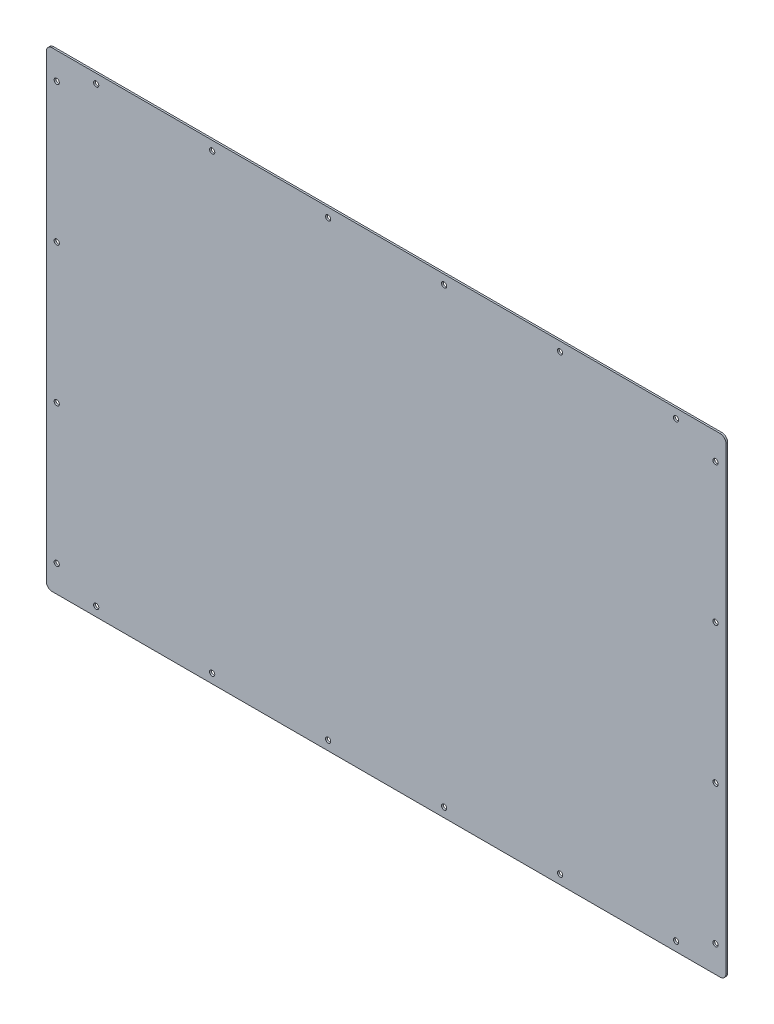
ISO-10303-21;
HEADER;
FILE_DESCRIPTION(('STEP AP214'),'2;1');
FILE_NAME('part.step','',(''),(''),'','','');
FILE_SCHEMA(('AUTOMOTIVE_DESIGN { 1 0 10303 214 1 1 1 1 }'));
ENDSEC;
DATA;
#1=APPLICATION_CONTEXT('core data for automotive mechanical design processes');
#2=APPLICATION_PROTOCOL_DEFINITION('international standard','automotive_design',2000,#1);
#3=PRODUCT_CONTEXT('',#1,'mechanical');
#4=PRODUCT('Part','Part','',(#3));
#5=PRODUCT_RELATED_PRODUCT_CATEGORY('part','',(#4));
#6=PRODUCT_DEFINITION_FORMATION('','',#4);
#7=PRODUCT_DEFINITION_CONTEXT('part definition',#1,'design');
#8=PRODUCT_DEFINITION('design','',#6,#7);
#9=PRODUCT_DEFINITION_SHAPE('','',#8);
#10=(LENGTH_UNIT() NAMED_UNIT(*) SI_UNIT(.MILLI.,.METRE.));
#11=(NAMED_UNIT(*) PLANE_ANGLE_UNIT() SI_UNIT($,.RADIAN.));
#12=(NAMED_UNIT(*) SI_UNIT($,.STERADIAN.) SOLID_ANGLE_UNIT());
#13=UNCERTAINTY_MEASURE_WITH_UNIT(LENGTH_MEASURE(1.E-05),#10,'distance_accuracy_value','');
#14=(GEOMETRIC_REPRESENTATION_CONTEXT(3) GLOBAL_UNCERTAINTY_ASSIGNED_CONTEXT((#13)) GLOBAL_UNIT_ASSIGNED_CONTEXT((#10,
#11,#12)) REPRESENTATION_CONTEXT('',''));
#15=CARTESIAN_POINT('',(0.,0.,0.));
#16=DIRECTION('',(0.,0.,1.));
#17=DIRECTION('',(1.,0.,0.));
#18=AXIS2_PLACEMENT_3D('',#15,#16,#17);
#19=CARTESIAN_POINT('',(0.,0.,-1.5));
#20=DIRECTION('',(0.,0.,1.));
#21=DIRECTION('',(1.,0.,0.));
#22=AXIS2_PLACEMENT_3D('',#19,#20,#21);
#23=PLANE('',#22);
#24=CARTESIAN_POINT('',(-284.,-180.,-1.5));
#25=DIRECTION('',(0.,0.,1.));
#26=DIRECTION('',(1.,0.,0.));
#27=AXIS2_PLACEMENT_3D('',#24,#25,#26);
#28=CIRCLE('',#27,2.24999999999997);
#29=CARTESIAN_POINT('',(-281.75,-180.,-1.5));
#30=VERTEX_POINT('',#29);
#31=EDGE_CURVE('E210',#30,#30,#28,.T.);
#32=ORIENTED_EDGE('',*,*,#31,.T.);
#33=EDGE_LOOP('',(#32));
#34=FACE_BOUND('',#33,.T.);
#35=CARTESIAN_POINT('',(284.,-180.,-1.5));
#36=DIRECTION('',(0.,0.,1.));
#37=DIRECTION('',(1.,0.,0.));
#38=AXIS2_PLACEMENT_3D('',#35,#36,#37);
#39=CIRCLE('',#38,2.24999999999997);
#40=CARTESIAN_POINT('',(286.25,-180.,-1.5));
#41=VERTEX_POINT('',#40);
#42=EDGE_CURVE('E213',#41,#41,#39,.T.);
#43=ORIENTED_EDGE('',*,*,#42,.T.);
#44=EDGE_LOOP('',(#43));
#45=FACE_BOUND('',#44,.T.);
#46=CARTESIAN_POINT('',(284.,-60.,-1.5));
#47=DIRECTION('',(0.,0.,1.));
#48=DIRECTION('',(1.,0.,0.));
#49=AXIS2_PLACEMENT_3D('',#46,#47,#48);
#50=CIRCLE('',#49,2.24999999999997);
#51=CARTESIAN_POINT('',(286.25,-60.,-1.5));
#52=VERTEX_POINT('',#51);
#53=EDGE_CURVE('E216',#52,#52,#50,.T.);
#54=ORIENTED_EDGE('',*,*,#53,.T.);
#55=EDGE_LOOP('',(#54));
#56=FACE_BOUND('',#55,.T.);
#57=CARTESIAN_POINT('',(284.,180.,-1.5));
#58=DIRECTION('',(0.,0.,1.));
#59=DIRECTION('',(1.,0.,0.));
#60=AXIS2_PLACEMENT_3D('',#57,#58,#59);
#61=CIRCLE('',#60,2.24999999999997);
#62=CARTESIAN_POINT('',(286.25,180.,-1.5));
#63=VERTEX_POINT('',#62);
#64=EDGE_CURVE('E219',#63,#63,#61,.T.);
#65=ORIENTED_EDGE('',*,*,#64,.T.);
#66=EDGE_LOOP('',(#65));
#67=FACE_BOUND('',#66,.T.);
#68=CARTESIAN_POINT('',(-250.,-195.,-1.5));
#69=DIRECTION('',(0.,0.,1.));
#70=DIRECTION('',(1.,0.,0.));
#71=AXIS2_PLACEMENT_3D('',#68,#69,#70);
#72=CIRCLE('',#71,2.25000000000003);
#73=CARTESIAN_POINT('',(-247.75,-195.,-1.5));
#74=VERTEX_POINT('',#73);
#75=EDGE_CURVE('E222',#74,#74,#72,.T.);
#76=ORIENTED_EDGE('',*,*,#75,.T.);
#77=EDGE_LOOP('',(#76));
#78=FACE_BOUND('',#77,.T.);
#79=CARTESIAN_POINT('',(-150.,-195.,-1.5));
#80=DIRECTION('',(0.,0.,1.));
#81=DIRECTION('',(1.,0.,0.));
#82=AXIS2_PLACEMENT_3D('',#79,#80,#81);
#83=CIRCLE('',#82,2.25);
#84=CARTESIAN_POINT('',(-147.75,-195.,-1.5));
#85=VERTEX_POINT('',#84);
#86=EDGE_CURVE('E225',#85,#85,#83,.T.);
#87=ORIENTED_EDGE('',*,*,#86,.T.);
#88=EDGE_LOOP('',(#87));
#89=FACE_BOUND('',#88,.T.);
#90=CARTESIAN_POINT('',(-50.0000000000001,-195.,-1.5));
#91=DIRECTION('',(0.,0.,1.));
#92=DIRECTION('',(1.,0.,0.));
#93=AXIS2_PLACEMENT_3D('',#90,#91,#92);
#94=CIRCLE('',#93,2.25);
#95=CARTESIAN_POINT('',(-47.7500000000001,-195.,-1.5));
#96=VERTEX_POINT('',#95);
#97=EDGE_CURVE('E228',#96,#96,#94,.T.);
#98=ORIENTED_EDGE('',*,*,#97,.T.);
#99=EDGE_LOOP('',(#98));
#100=FACE_BOUND('',#99,.T.);
#101=CARTESIAN_POINT('',(49.9999999999999,-195.,-1.5));
#102=DIRECTION('',(0.,0.,1.));
#103=DIRECTION('',(1.,0.,0.));
#104=AXIS2_PLACEMENT_3D('',#101,#102,#103);
#105=CIRCLE('',#104,2.25);
#106=CARTESIAN_POINT('',(52.2499999999999,-195.,-1.5));
#107=VERTEX_POINT('',#106);
#108=EDGE_CURVE('E231',#107,#107,#105,.T.);
#109=ORIENTED_EDGE('',*,*,#108,.T.);
#110=EDGE_LOOP('',(#109));
#111=FACE_BOUND('',#110,.T.);
#112=CARTESIAN_POINT('',(-150.,195.,-1.5));
#113=DIRECTION('',(0.,0.,1.));
#114=DIRECTION('',(1.,0.,0.));
#115=AXIS2_PLACEMENT_3D('',#112,#113,#114);
#116=CIRCLE('',#115,2.25);
#117=CARTESIAN_POINT('',(-147.75,195.,-1.5));
#118=VERTEX_POINT('',#117);
#119=EDGE_CURVE('E234',#118,#118,#116,.T.);
#120=ORIENTED_EDGE('',*,*,#119,.T.);
#121=EDGE_LOOP('',(#120));
#122=FACE_BOUND('',#121,.T.);
#123=CARTESIAN_POINT('',(-50.,195.,-1.5));
#124=DIRECTION('',(0.,0.,1.));
#125=DIRECTION('',(1.,0.,0.));
#126=AXIS2_PLACEMENT_3D('',#123,#124,#125);
#127=CIRCLE('',#126,2.25);
#128=CARTESIAN_POINT('',(-47.75,195.,-1.5));
#129=VERTEX_POINT('',#128);
#130=EDGE_CURVE('E237',#129,#129,#127,.T.);
#131=ORIENTED_EDGE('',*,*,#130,.T.);
#132=EDGE_LOOP('',(#131));
#133=FACE_BOUND('',#132,.T.);
#134=CARTESIAN_POINT('',(50.,195.,-1.5));
#135=DIRECTION('',(0.,0.,1.));
#136=DIRECTION('',(1.,0.,0.));
#137=AXIS2_PLACEMENT_3D('',#134,#135,#136);
#138=CIRCLE('',#137,2.25);
#139=CARTESIAN_POINT('',(52.25,195.,-1.5));
#140=VERTEX_POINT('',#139);
#141=EDGE_CURVE('E240',#140,#140,#138,.T.);
#142=ORIENTED_EDGE('',*,*,#141,.T.);
#143=EDGE_LOOP('',(#142));
#144=FACE_BOUND('',#143,.T.);
#145=CARTESIAN_POINT('',(150.,195.,-1.5));
#146=DIRECTION('',(0.,0.,1.));
#147=DIRECTION('',(1.,0.,0.));
#148=AXIS2_PLACEMENT_3D('',#145,#146,#147);
#149=CIRCLE('',#148,2.25);
#150=CARTESIAN_POINT('',(152.25,195.,-1.5));
#151=VERTEX_POINT('',#150);
#152=EDGE_CURVE('E243',#151,#151,#149,.T.);
#153=ORIENTED_EDGE('',*,*,#152,.T.);
#154=EDGE_LOOP('',(#153));
#155=FACE_BOUND('',#154,.T.);
#156=CARTESIAN_POINT('',(250.,195.,-1.5));
#157=DIRECTION('',(0.,0.,1.));
#158=DIRECTION('',(1.,0.,0.));
#159=AXIS2_PLACEMENT_3D('',#156,#157,#158);
#160=CIRCLE('',#159,2.25000000000003);
#161=CARTESIAN_POINT('',(252.25,195.,-1.5));
#162=VERTEX_POINT('',#161);
#163=EDGE_CURVE('E246',#162,#162,#160,.T.);
#164=ORIENTED_EDGE('',*,*,#163,.T.);
#165=EDGE_LOOP('',(#164));
#166=FACE_BOUND('',#165,.T.);
#167=CARTESIAN_POINT('',(284.,60.,-1.5));
#168=DIRECTION('',(0.,0.,1.));
#169=DIRECTION('',(1.,0.,0.));
#170=AXIS2_PLACEMENT_3D('',#167,#168,#169);
#171=CIRCLE('',#170,2.24999999999997);
#172=CARTESIAN_POINT('',(286.25,60.,-1.5));
#173=VERTEX_POINT('',#172);
#174=EDGE_CURVE('E249',#173,#173,#171,.T.);
#175=ORIENTED_EDGE('',*,*,#174,.T.);
#176=EDGE_LOOP('',(#175));
#177=FACE_BOUND('',#176,.T.);
#178=CARTESIAN_POINT('',(250.,-195.,-1.5));
#179=DIRECTION('',(0.,0.,1.));
#180=DIRECTION('',(1.,0.,0.));
#181=AXIS2_PLACEMENT_3D('',#178,#179,#180);
#182=CIRCLE('',#181,2.25000000000003);
#183=CARTESIAN_POINT('',(252.25,-195.,-1.5));
#184=VERTEX_POINT('',#183);
#185=EDGE_CURVE('E252',#184,#184,#182,.T.);
#186=ORIENTED_EDGE('',*,*,#185,.T.);
#187=EDGE_LOOP('',(#186));
#188=FACE_BOUND('',#187,.T.);
#189=CARTESIAN_POINT('',(150.,-195.,-1.5));
#190=DIRECTION('',(0.,0.,1.));
#191=DIRECTION('',(1.,0.,0.));
#192=AXIS2_PLACEMENT_3D('',#189,#190,#191);
#193=CIRCLE('',#192,2.25);
#194=CARTESIAN_POINT('',(152.25,-195.,-1.5));
#195=VERTEX_POINT('',#194);
#196=EDGE_CURVE('E255',#195,#195,#193,.T.);
#197=ORIENTED_EDGE('',*,*,#196,.T.);
#198=EDGE_LOOP('',(#197));
#199=FACE_BOUND('',#198,.T.);
#200=CARTESIAN_POINT('',(-284.,-59.9999999999999,-1.5));
#201=DIRECTION('',(0.,0.,1.));
#202=DIRECTION('',(1.,0.,0.));
#203=AXIS2_PLACEMENT_3D('',#200,#201,#202);
#204=CIRCLE('',#203,2.24999999999997);
#205=CARTESIAN_POINT('',(-281.75,-59.9999999999999,-1.5));
#206=VERTEX_POINT('',#205);
#207=EDGE_CURVE('E258',#206,#206,#204,.T.);
#208=ORIENTED_EDGE('',*,*,#207,.T.);
#209=EDGE_LOOP('',(#208));
#210=FACE_BOUND('',#209,.T.);
#211=CARTESIAN_POINT('',(-284.,59.9999999999999,-1.5));
#212=DIRECTION('',(0.,0.,1.));
#213=DIRECTION('',(1.,0.,0.));
#214=AXIS2_PLACEMENT_3D('',#211,#212,#213);
#215=CIRCLE('',#214,2.24999999999997);
#216=CARTESIAN_POINT('',(-281.75,59.9999999999999,-1.5));
#217=VERTEX_POINT('',#216);
#218=EDGE_CURVE('E261',#217,#217,#215,.T.);
#219=ORIENTED_EDGE('',*,*,#218,.T.);
#220=EDGE_LOOP('',(#219));
#221=FACE_BOUND('',#220,.T.);
#222=CARTESIAN_POINT('',(-284.,180.,-1.5));
#223=DIRECTION('',(0.,0.,1.));
#224=DIRECTION('',(1.,0.,0.));
#225=AXIS2_PLACEMENT_3D('',#222,#223,#224);
#226=CIRCLE('',#225,2.24999999999997);
#227=CARTESIAN_POINT('',(-281.75,180.,-1.5));
#228=VERTEX_POINT('',#227);
#229=EDGE_CURVE('E264',#228,#228,#226,.T.);
#230=ORIENTED_EDGE('',*,*,#229,.T.);
#231=EDGE_LOOP('',(#230));
#232=FACE_BOUND('',#231,.T.);
#233=CARTESIAN_POINT('',(-250.,195.,-1.5));
#234=DIRECTION('',(0.,0.,1.));
#235=DIRECTION('',(1.,0.,0.));
#236=AXIS2_PLACEMENT_3D('',#233,#234,#235);
#237=CIRCLE('',#236,2.25);
#238=CARTESIAN_POINT('',(-247.75,195.,-1.5));
#239=VERTEX_POINT('',#238);
#240=EDGE_CURVE('E267',#239,#239,#237,.T.);
#241=ORIENTED_EDGE('',*,*,#240,.T.);
#242=EDGE_LOOP('',(#241));
#243=FACE_BOUND('',#242,.T.);
#244=DIRECTION('',(1.,0.,0.));
#245=VECTOR('',#244,1.);
#246=CARTESIAN_POINT('',(-293.,-203.,-1.5));
#247=LINE('',#246,#245);
#248=CARTESIAN_POINT('',(-288.,-203.,-1.5));
#249=VERTEX_POINT('',#248);
#250=CARTESIAN_POINT('',(288.,-203.,-1.5));
#251=VERTEX_POINT('',#250);
#252=EDGE_CURVE('E117',#249,#251,#247,.T.);
#253=ORIENTED_EDGE('',*,*,#252,.F.);
#254=CARTESIAN_POINT('',(-288.,-198.,-1.5));
#255=DIRECTION('',(0.,0.,1.));
#256=DIRECTION('',(1.,0.,0.));
#257=AXIS2_PLACEMENT_3D('',#254,#255,#256);
#258=CIRCLE('',#257,5.);
#259=CARTESIAN_POINT('',(-293.,-198.,-1.5));
#260=VERTEX_POINT('',#259);
#261=EDGE_CURVE('E45',#260,#249,#258,.T.);
#262=ORIENTED_EDGE('',*,*,#261,.F.);
#263=DIRECTION('',(0.,-1.,0.));
#264=VECTOR('',#263,1.);
#265=CARTESIAN_POINT('',(-293.,203.,-1.5));
#266=LINE('',#265,#264);
#267=CARTESIAN_POINT('',(-293.,198.,-1.5));
#268=VERTEX_POINT('',#267);
#269=EDGE_CURVE('E103',#268,#260,#266,.T.);
#270=ORIENTED_EDGE('',*,*,#269,.F.);
#271=CARTESIAN_POINT('',(-288.,198.,-1.5));
#272=DIRECTION('',(0.,0.,1.));
#273=DIRECTION('',(1.,0.,0.));
#274=AXIS2_PLACEMENT_3D('',#271,#272,#273);
#275=CIRCLE('',#274,5.);
#276=CARTESIAN_POINT('',(-288.,203.,-1.5));
#277=VERTEX_POINT('',#276);
#278=EDGE_CURVE('E271',#277,#268,#275,.T.);
#279=ORIENTED_EDGE('',*,*,#278,.F.);
#280=DIRECTION('',(1.,0.,0.));
#281=VECTOR('',#280,1.);
#282=CARTESIAN_POINT('',(-293.,203.,-1.5));
#283=LINE('',#282,#281);
#284=CARTESIAN_POINT('',(288.,203.,-1.5));
#285=VERTEX_POINT('',#284);
#286=EDGE_CURVE('E134',#285,#277,#283,.F.);
#287=ORIENTED_EDGE('',*,*,#286,.F.);
#288=CARTESIAN_POINT('',(288.,198.,-1.5));
#289=DIRECTION('',(0.,0.,1.));
#290=DIRECTION('',(1.,0.,0.));
#291=AXIS2_PLACEMENT_3D('',#288,#289,#290);
#292=CIRCLE('',#291,5.);
#293=CARTESIAN_POINT('',(293.,198.,-1.5));
#294=VERTEX_POINT('',#293);
#295=EDGE_CURVE('E274',#294,#285,#292,.T.);
#296=ORIENTED_EDGE('',*,*,#295,.F.);
#297=DIRECTION('',(0.,1.,0.));
#298=VECTOR('',#297,1.);
#299=CARTESIAN_POINT('',(293.,203.,-1.5));
#300=LINE('',#299,#298);
#301=CARTESIAN_POINT('',(293.,-198.,-1.5));
#302=VERTEX_POINT('',#301);
#303=EDGE_CURVE('E137',#302,#294,#300,.T.);
#304=ORIENTED_EDGE('',*,*,#303,.F.);
#305=CARTESIAN_POINT('',(288.,-198.,-1.5));
#306=DIRECTION('',(0.,0.,1.));
#307=DIRECTION('',(1.,0.,0.));
#308=AXIS2_PLACEMENT_3D('',#305,#306,#307);
#309=CIRCLE('',#308,5.);
#310=EDGE_CURVE('E119',#251,#302,#309,.T.);
#311=ORIENTED_EDGE('',*,*,#310,.F.);
#312=EDGE_LOOP('',(#253,#262,#270,#279,#287,#296,#304,#311));
#313=FACE_BOUND('',#312,.T.);
#314=ADVANCED_FACE('F42',(#34,#45,#56,#67,#78,#89,#100,#111,#122,#133,#144,#155,#166,#177,#188,
#199,#210,#221,#232,#243,#313),#23,.F.);
#315=CARTESIAN_POINT('',(-293.,203.,-1.5));
#316=DIRECTION('',(-1.,0.,0.));
#317=DIRECTION('',(0.,-1.,0.));
#318=AXIS2_PLACEMENT_3D('',#315,#316,#317);
#319=PLANE('',#318);
#320=ORIENTED_EDGE('',*,*,#269,.T.);
#321=DIRECTION('',(0.,0.,1.));
#322=VECTOR('',#321,1.);
#323=CARTESIAN_POINT('',(-293.,-198.,-1.5));
#324=LINE('',#323,#322);
#325=CARTESIAN_POINT('',(-293.,-198.,0.));
#326=VERTEX_POINT('',#325);
#327=EDGE_CURVE('E114',#326,#260,#324,.F.);
#328=ORIENTED_EDGE('',*,*,#327,.F.);
#329=DIRECTION('',(0.,1.,0.));
#330=VECTOR('',#329,1.);
#331=CARTESIAN_POINT('',(-293.,0.,0.));
#332=LINE('',#331,#330);
#333=CARTESIAN_POINT('',(-293.,198.,0.));
#334=VERTEX_POINT('',#333);
#335=EDGE_CURVE('E209',#334,#326,#332,.F.);
#336=ORIENTED_EDGE('',*,*,#335,.F.);
#337=DIRECTION('',(0.,0.,1.));
#338=VECTOR('',#337,1.);
#339=CARTESIAN_POINT('',(-293.,198.,-1.5));
#340=LINE('',#339,#338);
#341=EDGE_CURVE('E270',#268,#334,#340,.T.);
#342=ORIENTED_EDGE('',*,*,#341,.F.);
#343=EDGE_LOOP('',(#320,#328,#336,#342));
#344=FACE_BOUND('',#343,.T.);
#345=ADVANCED_FACE('F410',(#344),#319,.T.);
#346=CARTESIAN_POINT('',(-288.,-198.,-1.5));
#347=DIRECTION('',(0.,0.,1.));
#348=DIRECTION('',(1.,0.,0.));
#349=AXIS2_PLACEMENT_3D('',#346,#347,#348);
#350=CYLINDRICAL_SURFACE('',#349,5.);
#351=ORIENTED_EDGE('',*,*,#261,.T.);
#352=DIRECTION('',(0.,0.,-1.));
#353=VECTOR('',#352,1.);
#354=CARTESIAN_POINT('',(-288.,-203.,-1.5));
#355=LINE('',#354,#353);
#356=CARTESIAN_POINT('',(-288.,-203.,0.));
#357=VERTEX_POINT('',#356);
#358=EDGE_CURVE('E112',#357,#249,#355,.T.);
#359=ORIENTED_EDGE('',*,*,#358,.F.);
#360=CARTESIAN_POINT('',(-288.,-198.,0.));
#361=DIRECTION('',(0.,0.,1.));
#362=DIRECTION('',(1.,0.,0.));
#363=AXIS2_PLACEMENT_3D('',#360,#361,#362);
#364=CIRCLE('',#363,5.);
#365=EDGE_CURVE('E207',#326,#357,#364,.T.);
#366=ORIENTED_EDGE('',*,*,#365,.F.);
#367=ORIENTED_EDGE('',*,*,#327,.T.);
#368=EDGE_LOOP('',(#351,#359,#366,#367));
#369=FACE_BOUND('',#368,.T.);
#370=ADVANCED_FACE('F109',(#369),#350,.T.);
#371=CARTESIAN_POINT('',(-293.,-203.,-1.5));
#372=DIRECTION('',(0.,-1.,0.));
#373=DIRECTION('',(0.,0.,-1.));
#374=AXIS2_PLACEMENT_3D('',#371,#372,#373);
#375=PLANE('',#374);
#376=ORIENTED_EDGE('',*,*,#252,.T.);
#377=DIRECTION('',(0.,0.,1.));
#378=VECTOR('',#377,1.);
#379=CARTESIAN_POINT('',(288.,-203.,-1.5));
#380=LINE('',#379,#378);
#381=CARTESIAN_POINT('',(288.,-203.,0.));
#382=VERTEX_POINT('',#381);
#383=EDGE_CURVE('E122',#382,#251,#380,.F.);
#384=ORIENTED_EDGE('',*,*,#383,.F.);
#385=DIRECTION('',(1.,0.,0.));
#386=VECTOR('',#385,1.);
#387=CARTESIAN_POINT('',(0.,-203.,0.));
#388=LINE('',#387,#386);
#389=EDGE_CURVE('E126',#357,#382,#388,.T.);
#390=ORIENTED_EDGE('',*,*,#389,.F.);
#391=ORIENTED_EDGE('',*,*,#358,.T.);
#392=EDGE_LOOP('',(#376,#384,#390,#391));
#393=FACE_BOUND('',#392,.T.);
#394=ADVANCED_FACE('F124',(#393),#375,.T.);
#395=CARTESIAN_POINT('',(288.,-198.,-1.5));
#396=DIRECTION('',(0.,0.,1.));
#397=DIRECTION('',(1.,0.,0.));
#398=AXIS2_PLACEMENT_3D('',#395,#396,#397);
#399=CYLINDRICAL_SURFACE('',#398,5.);
#400=ORIENTED_EDGE('',*,*,#310,.T.);
#401=DIRECTION('',(0.,0.,-1.));
#402=VECTOR('',#401,1.);
#403=CARTESIAN_POINT('',(293.,-198.,-1.5));
#404=LINE('',#403,#402);
#405=CARTESIAN_POINT('',(293.,-198.,0.));
#406=VERTEX_POINT('',#405);
#407=EDGE_CURVE('E138',#406,#302,#404,.T.);
#408=ORIENTED_EDGE('',*,*,#407,.F.);
#409=CARTESIAN_POINT('',(288.,-198.,0.));
#410=DIRECTION('',(0.,0.,1.));
#411=DIRECTION('',(1.,0.,0.));
#412=AXIS2_PLACEMENT_3D('',#409,#410,#411);
#413=CIRCLE('',#412,5.);
#414=EDGE_CURVE('E204',#382,#406,#413,.T.);
#415=ORIENTED_EDGE('',*,*,#414,.F.);
#416=ORIENTED_EDGE('',*,*,#383,.T.);
#417=EDGE_LOOP('',(#400,#408,#415,#416));
#418=FACE_BOUND('',#417,.T.);
#419=ADVANCED_FACE('F279',(#418),#399,.T.);
#420=CARTESIAN_POINT('',(293.,203.,-1.5));
#421=DIRECTION('',(1.,0.,0.));
#422=DIRECTION('',(0.,0.,-1.));
#423=AXIS2_PLACEMENT_3D('',#420,#421,#422);
#424=PLANE('',#423);
#425=DIRECTION('',(0.,1.,0.));
#426=VECTOR('',#425,1.);
#427=CARTESIAN_POINT('',(293.,0.,0.));
#428=LINE('',#427,#426);
#429=CARTESIAN_POINT('',(293.,198.,0.));
#430=VERTEX_POINT('',#429);
#431=EDGE_CURVE('E203',#406,#430,#428,.T.);
#432=ORIENTED_EDGE('',*,*,#431,.F.);
#433=ORIENTED_EDGE('',*,*,#407,.T.);
#434=ORIENTED_EDGE('',*,*,#303,.T.);
#435=DIRECTION('',(0.,0.,1.));
#436=VECTOR('',#435,1.);
#437=CARTESIAN_POINT('',(293.,198.,-1.5));
#438=LINE('',#437,#436);
#439=EDGE_CURVE('E275',#430,#294,#438,.F.);
#440=ORIENTED_EDGE('',*,*,#439,.F.);
#441=EDGE_LOOP('',(#432,#433,#434,#440));
#442=FACE_BOUND('',#441,.T.);
#443=ADVANCED_FACE('F298',(#442),#424,.T.);
#444=CARTESIAN_POINT('',(288.,198.,-1.5));
#445=DIRECTION('',(0.,0.,1.));
#446=DIRECTION('',(1.,0.,0.));
#447=AXIS2_PLACEMENT_3D('',#444,#445,#446);
#448=CYLINDRICAL_SURFACE('',#447,5.);
#449=ORIENTED_EDGE('',*,*,#295,.T.);
#450=DIRECTION('',(0.,0.,1.));
#451=VECTOR('',#450,1.);
#452=CARTESIAN_POINT('',(288.,203.,-1.5));
#453=LINE('',#452,#451);
#454=CARTESIAN_POINT('',(288.,203.,0.));
#455=VERTEX_POINT('',#454);
#456=EDGE_CURVE('E136',#455,#285,#453,.F.);
#457=ORIENTED_EDGE('',*,*,#456,.F.);
#458=CARTESIAN_POINT('',(288.,198.,0.));
#459=DIRECTION('',(0.,0.,1.));
#460=DIRECTION('',(1.,0.,0.));
#461=AXIS2_PLACEMENT_3D('',#458,#459,#460);
#462=CIRCLE('',#461,5.);
#463=EDGE_CURVE('E200',#430,#455,#462,.T.);
#464=ORIENTED_EDGE('',*,*,#463,.F.);
#465=ORIENTED_EDGE('',*,*,#439,.T.);
#466=EDGE_LOOP('',(#449,#457,#464,#465));
#467=FACE_BOUND('',#466,.T.);
#468=ADVANCED_FACE('F302',(#467),#448,.T.);
#469=CARTESIAN_POINT('',(-293.,203.,-1.5));
#470=DIRECTION('',(0.,1.,0.));
#471=DIRECTION('',(0.,0.,1.));
#472=AXIS2_PLACEMENT_3D('',#469,#470,#471);
#473=PLANE('',#472);
#474=ORIENTED_EDGE('',*,*,#286,.T.);
#475=DIRECTION('',(0.,0.,1.));
#476=VECTOR('',#475,1.);
#477=CARTESIAN_POINT('',(-288.,203.,-1.5));
#478=LINE('',#477,#476);
#479=CARTESIAN_POINT('',(-288.,203.,0.));
#480=VERTEX_POINT('',#479);
#481=EDGE_CURVE('E60',#480,#277,#478,.F.);
#482=ORIENTED_EDGE('',*,*,#481,.F.);
#483=DIRECTION('',(1.,0.,0.));
#484=VECTOR('',#483,1.);
#485=CARTESIAN_POINT('',(0.,203.,0.));
#486=LINE('',#485,#484);
#487=EDGE_CURVE('E199',#455,#480,#486,.F.);
#488=ORIENTED_EDGE('',*,*,#487,.F.);
#489=ORIENTED_EDGE('',*,*,#456,.T.);
#490=EDGE_LOOP('',(#474,#482,#488,#489));
#491=FACE_BOUND('',#490,.T.);
#492=ADVANCED_FACE('F304',(#491),#473,.T.);
#493=CARTESIAN_POINT('',(-288.,198.,-1.5));
#494=DIRECTION('',(0.,0.,1.));
#495=DIRECTION('',(1.,0.,0.));
#496=AXIS2_PLACEMENT_3D('',#493,#494,#495);
#497=CYLINDRICAL_SURFACE('',#496,5.);
#498=ORIENTED_EDGE('',*,*,#278,.T.);
#499=ORIENTED_EDGE('',*,*,#341,.T.);
#500=CARTESIAN_POINT('',(-288.,198.,0.));
#501=DIRECTION('',(0.,0.,1.));
#502=DIRECTION('',(1.,0.,0.));
#503=AXIS2_PLACEMENT_3D('',#500,#501,#502);
#504=CIRCLE('',#503,5.);
#505=EDGE_CURVE('E196',#480,#334,#504,.T.);
#506=ORIENTED_EDGE('',*,*,#505,.F.);
#507=ORIENTED_EDGE('',*,*,#481,.T.);
#508=EDGE_LOOP('',(#498,#499,#506,#507));
#509=FACE_BOUND('',#508,.T.);
#510=ADVANCED_FACE('F307',(#509),#497,.T.);
#511=CARTESIAN_POINT('',(-250.,195.,-10.));
#512=DIRECTION('',(0.,0.,1.));
#513=DIRECTION('',(1.,0.,0.));
#514=AXIS2_PLACEMENT_3D('',#511,#512,#513);
#515=CYLINDRICAL_SURFACE('',#514,2.25);
#516=ORIENTED_EDGE('',*,*,#240,.F.);
#517=EDGE_LOOP('',(#516));
#518=FACE_BOUND('',#517,.T.);
#519=CARTESIAN_POINT('',(-250.,195.,0.));
#520=DIRECTION('',(0.,0.,1.));
#521=DIRECTION('',(1.,0.,0.));
#522=AXIS2_PLACEMENT_3D('',#519,#520,#521);
#523=CIRCLE('',#522,2.25);
#524=CARTESIAN_POINT('',(-247.75,195.,0.));
#525=VERTEX_POINT('',#524);
#526=EDGE_CURVE('E193',#525,#525,#523,.F.);
#527=ORIENTED_EDGE('',*,*,#526,.F.);
#528=EDGE_LOOP('',(#527));
#529=FACE_BOUND('',#528,.T.);
#530=ADVANCED_FACE('F313',(#518,#529),#515,.F.);
#531=CARTESIAN_POINT('',(-284.,180.,-10.));
#532=DIRECTION('',(0.,0.,1.));
#533=DIRECTION('',(1.,0.,0.));
#534=AXIS2_PLACEMENT_3D('',#531,#532,#533);
#535=CYLINDRICAL_SURFACE('',#534,2.24999999999997);
#536=ORIENTED_EDGE('',*,*,#229,.F.);
#537=EDGE_LOOP('',(#536));
#538=FACE_BOUND('',#537,.T.);
#539=CARTESIAN_POINT('',(-284.,180.,0.));
#540=DIRECTION('',(0.,0.,1.));
#541=DIRECTION('',(1.,0.,0.));
#542=AXIS2_PLACEMENT_3D('',#539,#540,#541);
#543=CIRCLE('',#542,2.24999999999997);
#544=CARTESIAN_POINT('',(-281.75,180.,0.));
#545=VERTEX_POINT('',#544);
#546=EDGE_CURVE('E190',#545,#545,#543,.F.);
#547=ORIENTED_EDGE('',*,*,#546,.F.);
#548=EDGE_LOOP('',(#547));
#549=FACE_BOUND('',#548,.T.);
#550=ADVANCED_FACE('F395',(#538,#549),#535,.F.);
#551=CARTESIAN_POINT('',(-284.,59.9999999999999,-10.));
#552=DIRECTION('',(0.,0.,1.));
#553=DIRECTION('',(1.,0.,0.));
#554=AXIS2_PLACEMENT_3D('',#551,#552,#553);
#555=CYLINDRICAL_SURFACE('',#554,2.24999999999997);
#556=ORIENTED_EDGE('',*,*,#218,.F.);
#557=EDGE_LOOP('',(#556));
#558=FACE_BOUND('',#557,.T.);
#559=CARTESIAN_POINT('',(-284.,59.9999999999999,0.));
#560=DIRECTION('',(0.,0.,1.));
#561=DIRECTION('',(1.,0.,0.));
#562=AXIS2_PLACEMENT_3D('',#559,#560,#561);
#563=CIRCLE('',#562,2.24999999999997);
#564=CARTESIAN_POINT('',(-281.75,59.9999999999999,0.));
#565=VERTEX_POINT('',#564);
#566=EDGE_CURVE('E187',#565,#565,#563,.F.);
#567=ORIENTED_EDGE('',*,*,#566,.F.);
#568=EDGE_LOOP('',(#567));
#569=FACE_BOUND('',#568,.T.);
#570=ADVANCED_FACE('F391',(#558,#569),#555,.F.);
#571=CARTESIAN_POINT('',(-284.,-59.9999999999999,-10.));
#572=DIRECTION('',(0.,0.,1.));
#573=DIRECTION('',(1.,0.,0.));
#574=AXIS2_PLACEMENT_3D('',#571,#572,#573);
#575=CYLINDRICAL_SURFACE('',#574,2.24999999999997);
#576=ORIENTED_EDGE('',*,*,#207,.F.);
#577=EDGE_LOOP('',(#576));
#578=FACE_BOUND('',#577,.T.);
#579=CARTESIAN_POINT('',(-284.,-59.9999999999999,0.));
#580=DIRECTION('',(0.,0.,1.));
#581=DIRECTION('',(1.,0.,0.));
#582=AXIS2_PLACEMENT_3D('',#579,#580,#581);
#583=CIRCLE('',#582,2.24999999999997);
#584=CARTESIAN_POINT('',(-281.75,-59.9999999999999,0.));
#585=VERTEX_POINT('',#584);
#586=EDGE_CURVE('E184',#585,#585,#583,.F.);
#587=ORIENTED_EDGE('',*,*,#586,.F.);
#588=EDGE_LOOP('',(#587));
#589=FACE_BOUND('',#588,.T.);
#590=ADVANCED_FACE('F387',(#578,#589),#575,.F.);
#591=CARTESIAN_POINT('',(150.,-195.,-10.));
#592=DIRECTION('',(0.,0.,1.));
#593=DIRECTION('',(1.,0.,0.));
#594=AXIS2_PLACEMENT_3D('',#591,#592,#593);
#595=CYLINDRICAL_SURFACE('',#594,2.25);
#596=ORIENTED_EDGE('',*,*,#196,.F.);
#597=EDGE_LOOP('',(#596));
#598=FACE_BOUND('',#597,.T.);
#599=CARTESIAN_POINT('',(150.,-195.,0.));
#600=DIRECTION('',(0.,0.,1.));
#601=DIRECTION('',(1.,0.,0.));
#602=AXIS2_PLACEMENT_3D('',#599,#600,#601);
#603=CIRCLE('',#602,2.25);
#604=CARTESIAN_POINT('',(152.25,-195.,0.));
#605=VERTEX_POINT('',#604);
#606=EDGE_CURVE('E181',#605,#605,#603,.F.);
#607=ORIENTED_EDGE('',*,*,#606,.F.);
#608=EDGE_LOOP('',(#607));
#609=FACE_BOUND('',#608,.T.);
#610=ADVANCED_FACE('F383',(#598,#609),#595,.F.);
#611=CARTESIAN_POINT('',(250.,-195.,-10.));
#612=DIRECTION('',(0.,0.,1.));
#613=DIRECTION('',(1.,0.,0.));
#614=AXIS2_PLACEMENT_3D('',#611,#612,#613);
#615=CYLINDRICAL_SURFACE('',#614,2.25000000000003);
#616=ORIENTED_EDGE('',*,*,#185,.F.);
#617=EDGE_LOOP('',(#616));
#618=FACE_BOUND('',#617,.T.);
#619=CARTESIAN_POINT('',(250.,-195.,0.));
#620=DIRECTION('',(0.,0.,1.));
#621=DIRECTION('',(1.,0.,0.));
#622=AXIS2_PLACEMENT_3D('',#619,#620,#621);
#623=CIRCLE('',#622,2.25000000000003);
#624=CARTESIAN_POINT('',(252.25,-195.,0.));
#625=VERTEX_POINT('',#624);
#626=EDGE_CURVE('E178',#625,#625,#623,.F.);
#627=ORIENTED_EDGE('',*,*,#626,.F.);
#628=EDGE_LOOP('',(#627));
#629=FACE_BOUND('',#628,.T.);
#630=ADVANCED_FACE('F379',(#618,#629),#615,.F.);
#631=CARTESIAN_POINT('',(284.,60.,-10.));
#632=DIRECTION('',(0.,0.,1.));
#633=DIRECTION('',(1.,0.,0.));
#634=AXIS2_PLACEMENT_3D('',#631,#632,#633);
#635=CYLINDRICAL_SURFACE('',#634,2.24999999999997);
#636=ORIENTED_EDGE('',*,*,#174,.F.);
#637=EDGE_LOOP('',(#636));
#638=FACE_BOUND('',#637,.T.);
#639=CARTESIAN_POINT('',(284.,60.,0.));
#640=DIRECTION('',(0.,0.,1.));
#641=DIRECTION('',(1.,0.,0.));
#642=AXIS2_PLACEMENT_3D('',#639,#640,#641);
#643=CIRCLE('',#642,2.24999999999997);
#644=CARTESIAN_POINT('',(286.25,60.,0.));
#645=VERTEX_POINT('',#644);
#646=EDGE_CURVE('E175',#645,#645,#643,.F.);
#647=ORIENTED_EDGE('',*,*,#646,.F.);
#648=EDGE_LOOP('',(#647));
#649=FACE_BOUND('',#648,.T.);
#650=ADVANCED_FACE('F375',(#638,#649),#635,.F.);
#651=CARTESIAN_POINT('',(250.,195.,-10.));
#652=DIRECTION('',(0.,0.,1.));
#653=DIRECTION('',(1.,0.,0.));
#654=AXIS2_PLACEMENT_3D('',#651,#652,#653);
#655=CYLINDRICAL_SURFACE('',#654,2.25000000000003);
#656=ORIENTED_EDGE('',*,*,#163,.F.);
#657=EDGE_LOOP('',(#656));
#658=FACE_BOUND('',#657,.T.);
#659=CARTESIAN_POINT('',(250.,195.,0.));
#660=DIRECTION('',(0.,0.,1.));
#661=DIRECTION('',(1.,0.,0.));
#662=AXIS2_PLACEMENT_3D('',#659,#660,#661);
#663=CIRCLE('',#662,2.25000000000003);
#664=CARTESIAN_POINT('',(252.25,195.,0.));
#665=VERTEX_POINT('',#664);
#666=EDGE_CURVE('E172',#665,#665,#663,.F.);
#667=ORIENTED_EDGE('',*,*,#666,.F.);
#668=EDGE_LOOP('',(#667));
#669=FACE_BOUND('',#668,.T.);
#670=ADVANCED_FACE('F371',(#658,#669),#655,.F.);
#671=CARTESIAN_POINT('',(150.,195.,-10.));
#672=DIRECTION('',(0.,0.,1.));
#673=DIRECTION('',(1.,0.,0.));
#674=AXIS2_PLACEMENT_3D('',#671,#672,#673);
#675=CYLINDRICAL_SURFACE('',#674,2.25);
#676=ORIENTED_EDGE('',*,*,#152,.F.);
#677=EDGE_LOOP('',(#676));
#678=FACE_BOUND('',#677,.T.);
#679=CARTESIAN_POINT('',(150.,195.,0.));
#680=DIRECTION('',(0.,0.,1.));
#681=DIRECTION('',(1.,0.,0.));
#682=AXIS2_PLACEMENT_3D('',#679,#680,#681);
#683=CIRCLE('',#682,2.25);
#684=CARTESIAN_POINT('',(152.25,195.,0.));
#685=VERTEX_POINT('',#684);
#686=EDGE_CURVE('E169',#685,#685,#683,.F.);
#687=ORIENTED_EDGE('',*,*,#686,.F.);
#688=EDGE_LOOP('',(#687));
#689=FACE_BOUND('',#688,.T.);
#690=ADVANCED_FACE('F367',(#678,#689),#675,.F.);
#691=CARTESIAN_POINT('',(50.,195.,-10.));
#692=DIRECTION('',(0.,0.,1.));
#693=DIRECTION('',(1.,0.,0.));
#694=AXIS2_PLACEMENT_3D('',#691,#692,#693);
#695=CYLINDRICAL_SURFACE('',#694,2.25);
#696=ORIENTED_EDGE('',*,*,#141,.F.);
#697=EDGE_LOOP('',(#696));
#698=FACE_BOUND('',#697,.T.);
#699=CARTESIAN_POINT('',(50.,195.,0.));
#700=DIRECTION('',(0.,0.,1.));
#701=DIRECTION('',(1.,0.,0.));
#702=AXIS2_PLACEMENT_3D('',#699,#700,#701);
#703=CIRCLE('',#702,2.25);
#704=CARTESIAN_POINT('',(52.25,195.,0.));
#705=VERTEX_POINT('',#704);
#706=EDGE_CURVE('E166',#705,#705,#703,.F.);
#707=ORIENTED_EDGE('',*,*,#706,.F.);
#708=EDGE_LOOP('',(#707));
#709=FACE_BOUND('',#708,.T.);
#710=ADVANCED_FACE('F363',(#698,#709),#695,.F.);
#711=CARTESIAN_POINT('',(-50.,195.,-10.));
#712=DIRECTION('',(0.,0.,1.));
#713=DIRECTION('',(1.,0.,0.));
#714=AXIS2_PLACEMENT_3D('',#711,#712,#713);
#715=CYLINDRICAL_SURFACE('',#714,2.25);
#716=ORIENTED_EDGE('',*,*,#130,.F.);
#717=EDGE_LOOP('',(#716));
#718=FACE_BOUND('',#717,.T.);
#719=CARTESIAN_POINT('',(-50.,195.,0.));
#720=DIRECTION('',(0.,0.,1.));
#721=DIRECTION('',(1.,0.,0.));
#722=AXIS2_PLACEMENT_3D('',#719,#720,#721);
#723=CIRCLE('',#722,2.25);
#724=CARTESIAN_POINT('',(-47.75,195.,0.));
#725=VERTEX_POINT('',#724);
#726=EDGE_CURVE('E163',#725,#725,#723,.F.);
#727=ORIENTED_EDGE('',*,*,#726,.F.);
#728=EDGE_LOOP('',(#727));
#729=FACE_BOUND('',#728,.T.);
#730=ADVANCED_FACE('F359',(#718,#729),#715,.F.);
#731=CARTESIAN_POINT('',(-150.,195.,-10.));
#732=DIRECTION('',(0.,0.,1.));
#733=DIRECTION('',(1.,0.,0.));
#734=AXIS2_PLACEMENT_3D('',#731,#732,#733);
#735=CYLINDRICAL_SURFACE('',#734,2.25);
#736=ORIENTED_EDGE('',*,*,#119,.F.);
#737=EDGE_LOOP('',(#736));
#738=FACE_BOUND('',#737,.T.);
#739=CARTESIAN_POINT('',(-150.,195.,0.));
#740=DIRECTION('',(0.,0.,1.));
#741=DIRECTION('',(1.,0.,0.));
#742=AXIS2_PLACEMENT_3D('',#739,#740,#741);
#743=CIRCLE('',#742,2.25);
#744=CARTESIAN_POINT('',(-147.75,195.,0.));
#745=VERTEX_POINT('',#744);
#746=EDGE_CURVE('E160',#745,#745,#743,.F.);
#747=ORIENTED_EDGE('',*,*,#746,.F.);
#748=EDGE_LOOP('',(#747));
#749=FACE_BOUND('',#748,.T.);
#750=ADVANCED_FACE('F355',(#738,#749),#735,.F.);
#751=CARTESIAN_POINT('',(49.9999999999999,-195.,-10.));
#752=DIRECTION('',(0.,0.,1.));
#753=DIRECTION('',(1.,0.,0.));
#754=AXIS2_PLACEMENT_3D('',#751,#752,#753);
#755=CYLINDRICAL_SURFACE('',#754,2.25);
#756=ORIENTED_EDGE('',*,*,#108,.F.);
#757=EDGE_LOOP('',(#756));
#758=FACE_BOUND('',#757,.T.);
#759=CARTESIAN_POINT('',(49.9999999999999,-195.,0.));
#760=DIRECTION('',(0.,0.,1.));
#761=DIRECTION('',(1.,0.,0.));
#762=AXIS2_PLACEMENT_3D('',#759,#760,#761);
#763=CIRCLE('',#762,2.25);
#764=CARTESIAN_POINT('',(52.2499999999999,-195.,0.));
#765=VERTEX_POINT('',#764);
#766=EDGE_CURVE('E157',#765,#765,#763,.F.);
#767=ORIENTED_EDGE('',*,*,#766,.F.);
#768=EDGE_LOOP('',(#767));
#769=FACE_BOUND('',#768,.T.);
#770=ADVANCED_FACE('F351',(#758,#769),#755,.F.);
#771=CARTESIAN_POINT('',(-50.0000000000001,-195.,-10.));
#772=DIRECTION('',(0.,0.,1.));
#773=DIRECTION('',(1.,0.,0.));
#774=AXIS2_PLACEMENT_3D('',#771,#772,#773);
#775=CYLINDRICAL_SURFACE('',#774,2.25);
#776=ORIENTED_EDGE('',*,*,#97,.F.);
#777=EDGE_LOOP('',(#776));
#778=FACE_BOUND('',#777,.T.);
#779=CARTESIAN_POINT('',(-50.0000000000001,-195.,0.));
#780=DIRECTION('',(0.,0.,1.));
#781=DIRECTION('',(1.,0.,0.));
#782=AXIS2_PLACEMENT_3D('',#779,#780,#781);
#783=CIRCLE('',#782,2.25);
#784=CARTESIAN_POINT('',(-47.7500000000001,-195.,0.));
#785=VERTEX_POINT('',#784);
#786=EDGE_CURVE('E154',#785,#785,#783,.F.);
#787=ORIENTED_EDGE('',*,*,#786,.F.);
#788=EDGE_LOOP('',(#787));
#789=FACE_BOUND('',#788,.T.);
#790=ADVANCED_FACE('F347',(#778,#789),#775,.F.);
#791=CARTESIAN_POINT('',(-150.,-195.,-10.));
#792=DIRECTION('',(0.,0.,1.));
#793=DIRECTION('',(1.,0.,0.));
#794=AXIS2_PLACEMENT_3D('',#791,#792,#793);
#795=CYLINDRICAL_SURFACE('',#794,2.25);
#796=ORIENTED_EDGE('',*,*,#86,.F.);
#797=EDGE_LOOP('',(#796));
#798=FACE_BOUND('',#797,.T.);
#799=CARTESIAN_POINT('',(-150.,-195.,0.));
#800=DIRECTION('',(0.,0.,1.));
#801=DIRECTION('',(1.,0.,0.));
#802=AXIS2_PLACEMENT_3D('',#799,#800,#801);
#803=CIRCLE('',#802,2.25);
#804=CARTESIAN_POINT('',(-147.75,-195.,0.));
#805=VERTEX_POINT('',#804);
#806=EDGE_CURVE('E151',#805,#805,#803,.F.);
#807=ORIENTED_EDGE('',*,*,#806,.F.);
#808=EDGE_LOOP('',(#807));
#809=FACE_BOUND('',#808,.T.);
#810=ADVANCED_FACE('F343',(#798,#809),#795,.F.);
#811=CARTESIAN_POINT('',(-250.,-195.,-10.));
#812=DIRECTION('',(0.,0.,1.));
#813=DIRECTION('',(1.,0.,0.));
#814=AXIS2_PLACEMENT_3D('',#811,#812,#813);
#815=CYLINDRICAL_SURFACE('',#814,2.25000000000003);
#816=ORIENTED_EDGE('',*,*,#75,.F.);
#817=EDGE_LOOP('',(#816));
#818=FACE_BOUND('',#817,.T.);
#819=CARTESIAN_POINT('',(-250.,-195.,0.));
#820=DIRECTION('',(0.,0.,1.));
#821=DIRECTION('',(1.,0.,0.));
#822=AXIS2_PLACEMENT_3D('',#819,#820,#821);
#823=CIRCLE('',#822,2.25000000000003);
#824=CARTESIAN_POINT('',(-247.75,-195.,0.));
#825=VERTEX_POINT('',#824);
#826=EDGE_CURVE('E148',#825,#825,#823,.F.);
#827=ORIENTED_EDGE('',*,*,#826,.F.);
#828=EDGE_LOOP('',(#827));
#829=FACE_BOUND('',#828,.T.);
#830=ADVANCED_FACE('F339',(#818,#829),#815,.F.);
#831=CARTESIAN_POINT('',(284.,180.,-10.));
#832=DIRECTION('',(0.,0.,1.));
#833=DIRECTION('',(1.,0.,0.));
#834=AXIS2_PLACEMENT_3D('',#831,#832,#833);
#835=CYLINDRICAL_SURFACE('',#834,2.24999999999997);
#836=ORIENTED_EDGE('',*,*,#64,.F.);
#837=EDGE_LOOP('',(#836));
#838=FACE_BOUND('',#837,.T.);
#839=CARTESIAN_POINT('',(284.,180.,0.));
#840=DIRECTION('',(0.,0.,1.));
#841=DIRECTION('',(1.,0.,0.));
#842=AXIS2_PLACEMENT_3D('',#839,#840,#841);
#843=CIRCLE('',#842,2.24999999999997);
#844=CARTESIAN_POINT('',(286.25,180.,0.));
#845=VERTEX_POINT('',#844);
#846=EDGE_CURVE('E145',#845,#845,#843,.F.);
#847=ORIENTED_EDGE('',*,*,#846,.F.);
#848=EDGE_LOOP('',(#847));
#849=FACE_BOUND('',#848,.T.);
#850=ADVANCED_FACE('F335',(#838,#849),#835,.F.);
#851=CARTESIAN_POINT('',(284.,-60.,-10.));
#852=DIRECTION('',(0.,0.,1.));
#853=DIRECTION('',(1.,0.,0.));
#854=AXIS2_PLACEMENT_3D('',#851,#852,#853);
#855=CYLINDRICAL_SURFACE('',#854,2.24999999999997);
#856=ORIENTED_EDGE('',*,*,#53,.F.);
#857=EDGE_LOOP('',(#856));
#858=FACE_BOUND('',#857,.T.);
#859=CARTESIAN_POINT('',(284.,-60.,0.));
#860=DIRECTION('',(0.,0.,1.));
#861=DIRECTION('',(1.,0.,0.));
#862=AXIS2_PLACEMENT_3D('',#859,#860,#861);
#863=CIRCLE('',#862,2.24999999999997);
#864=CARTESIAN_POINT('',(286.25,-60.,0.));
#865=VERTEX_POINT('',#864);
#866=EDGE_CURVE('E142',#865,#865,#863,.F.);
#867=ORIENTED_EDGE('',*,*,#866,.F.);
#868=EDGE_LOOP('',(#867));
#869=FACE_BOUND('',#868,.T.);
#870=ADVANCED_FACE('F331',(#858,#869),#855,.F.);
#871=CARTESIAN_POINT('',(284.,-180.,-10.));
#872=DIRECTION('',(0.,0.,1.));
#873=DIRECTION('',(1.,0.,0.));
#874=AXIS2_PLACEMENT_3D('',#871,#872,#873);
#875=CYLINDRICAL_SURFACE('',#874,2.24999999999997);
#876=ORIENTED_EDGE('',*,*,#42,.F.);
#877=EDGE_LOOP('',(#876));
#878=FACE_BOUND('',#877,.T.);
#879=CARTESIAN_POINT('',(284.,-180.,0.));
#880=DIRECTION('',(0.,0.,1.));
#881=DIRECTION('',(1.,0.,0.));
#882=AXIS2_PLACEMENT_3D('',#879,#880,#881);
#883=CIRCLE('',#882,2.24999999999997);
#884=CARTESIAN_POINT('',(286.25,-180.,0.));
#885=VERTEX_POINT('',#884);
#886=EDGE_CURVE('E51',#885,#885,#883,.F.);
#887=ORIENTED_EDGE('',*,*,#886,.F.);
#888=EDGE_LOOP('',(#887));
#889=FACE_BOUND('',#888,.T.);
#890=ADVANCED_FACE('F324',(#878,#889),#875,.F.);
#891=CARTESIAN_POINT('',(-284.,-180.,-10.));
#892=DIRECTION('',(0.,0.,1.));
#893=DIRECTION('',(1.,0.,0.));
#894=AXIS2_PLACEMENT_3D('',#891,#892,#893);
#895=CYLINDRICAL_SURFACE('',#894,2.24999999999997);
#896=ORIENTED_EDGE('',*,*,#31,.F.);
#897=EDGE_LOOP('',(#896));
#898=FACE_BOUND('',#897,.T.);
#899=CARTESIAN_POINT('',(-284.,-180.,0.));
#900=DIRECTION('',(0.,0.,1.));
#901=DIRECTION('',(1.,0.,0.));
#902=AXIS2_PLACEMENT_3D('',#899,#900,#901);
#903=CIRCLE('',#902,2.24999999999997);
#904=CARTESIAN_POINT('',(-281.75,-180.,0.));
#905=VERTEX_POINT('',#904);
#906=EDGE_CURVE('E11',#905,#905,#903,.F.);
#907=ORIENTED_EDGE('',*,*,#906,.F.);
#908=EDGE_LOOP('',(#907));
#909=FACE_BOUND('',#908,.T.);
#910=ADVANCED_FACE('F318',(#898,#909),#895,.F.);
#911=CARTESIAN_POINT('',(0.,0.,0.));
#912=DIRECTION('',(0.,0.,1.));
#913=DIRECTION('',(1.,0.,0.));
#914=AXIS2_PLACEMENT_3D('',#911,#912,#913);
#915=PLANE('',#914);
#916=ORIENTED_EDGE('',*,*,#906,.T.);
#917=EDGE_LOOP('',(#916));
#918=FACE_BOUND('',#917,.T.);
#919=ORIENTED_EDGE('',*,*,#886,.T.);
#920=EDGE_LOOP('',(#919));
#921=FACE_BOUND('',#920,.T.);
#922=ORIENTED_EDGE('',*,*,#866,.T.);
#923=EDGE_LOOP('',(#922));
#924=FACE_BOUND('',#923,.T.);
#925=ORIENTED_EDGE('',*,*,#846,.T.);
#926=EDGE_LOOP('',(#925));
#927=FACE_BOUND('',#926,.T.);
#928=ORIENTED_EDGE('',*,*,#826,.T.);
#929=EDGE_LOOP('',(#928));
#930=FACE_BOUND('',#929,.T.);
#931=ORIENTED_EDGE('',*,*,#806,.T.);
#932=EDGE_LOOP('',(#931));
#933=FACE_BOUND('',#932,.T.);
#934=ORIENTED_EDGE('',*,*,#786,.T.);
#935=EDGE_LOOP('',(#934));
#936=FACE_BOUND('',#935,.T.);
#937=ORIENTED_EDGE('',*,*,#766,.T.);
#938=EDGE_LOOP('',(#937));
#939=FACE_BOUND('',#938,.T.);
#940=ORIENTED_EDGE('',*,*,#746,.T.);
#941=EDGE_LOOP('',(#940));
#942=FACE_BOUND('',#941,.T.);
#943=ORIENTED_EDGE('',*,*,#726,.T.);
#944=EDGE_LOOP('',(#943));
#945=FACE_BOUND('',#944,.T.);
#946=ORIENTED_EDGE('',*,*,#706,.T.);
#947=EDGE_LOOP('',(#946));
#948=FACE_BOUND('',#947,.T.);
#949=ORIENTED_EDGE('',*,*,#686,.T.);
#950=EDGE_LOOP('',(#949));
#951=FACE_BOUND('',#950,.T.);
#952=ORIENTED_EDGE('',*,*,#666,.T.);
#953=EDGE_LOOP('',(#952));
#954=FACE_BOUND('',#953,.T.);
#955=ORIENTED_EDGE('',*,*,#646,.T.);
#956=EDGE_LOOP('',(#955));
#957=FACE_BOUND('',#956,.T.);
#958=ORIENTED_EDGE('',*,*,#626,.T.);
#959=EDGE_LOOP('',(#958));
#960=FACE_BOUND('',#959,.T.);
#961=ORIENTED_EDGE('',*,*,#606,.T.);
#962=EDGE_LOOP('',(#961));
#963=FACE_BOUND('',#962,.T.);
#964=ORIENTED_EDGE('',*,*,#586,.T.);
#965=EDGE_LOOP('',(#964));
#966=FACE_BOUND('',#965,.T.);
#967=ORIENTED_EDGE('',*,*,#566,.T.);
#968=EDGE_LOOP('',(#967));
#969=FACE_BOUND('',#968,.T.);
#970=ORIENTED_EDGE('',*,*,#546,.T.);
#971=EDGE_LOOP('',(#970));
#972=FACE_BOUND('',#971,.T.);
#973=ORIENTED_EDGE('',*,*,#526,.T.);
#974=EDGE_LOOP('',(#973));
#975=FACE_BOUND('',#974,.T.);
#976=ORIENTED_EDGE('',*,*,#487,.T.);
#977=ORIENTED_EDGE('',*,*,#505,.T.);
#978=ORIENTED_EDGE('',*,*,#335,.T.);
#979=ORIENTED_EDGE('',*,*,#365,.T.);
#980=ORIENTED_EDGE('',*,*,#389,.T.);
#981=ORIENTED_EDGE('',*,*,#414,.T.);
#982=ORIENTED_EDGE('',*,*,#431,.T.);
#983=ORIENTED_EDGE('',*,*,#463,.T.);
#984=EDGE_LOOP('',(#976,#977,#978,#979,#980,#981,#982,#983));
#985=FACE_BOUND('',#984,.T.);
#986=ADVANCED_FACE('F284',(#918,#921,#924,#927,#930,#933,#936,#939,#942,#945,#948,#951,#954,
#957,#960,#963,#966,#969,#972,#975,#985),#915,.T.);
#987=CLOSED_SHELL('',(#314,#345,#370,#394,#419,#443,#468,#492,#510,#530,#550,#570,#590,#610,
#630,#650,#670,#690,#710,#730,#750,#770,#790,#810,#830,#850,#870,#890,#910,#986));
#988=MANIFOLD_SOLID_BREP('B2',#987);
#989=ADVANCED_BREP_SHAPE_REPRESENTATION('',(#18,#988),#14);
#990=SHAPE_DEFINITION_REPRESENTATION(#9,#989);
ENDSEC;
END-ISO-10303-21;
